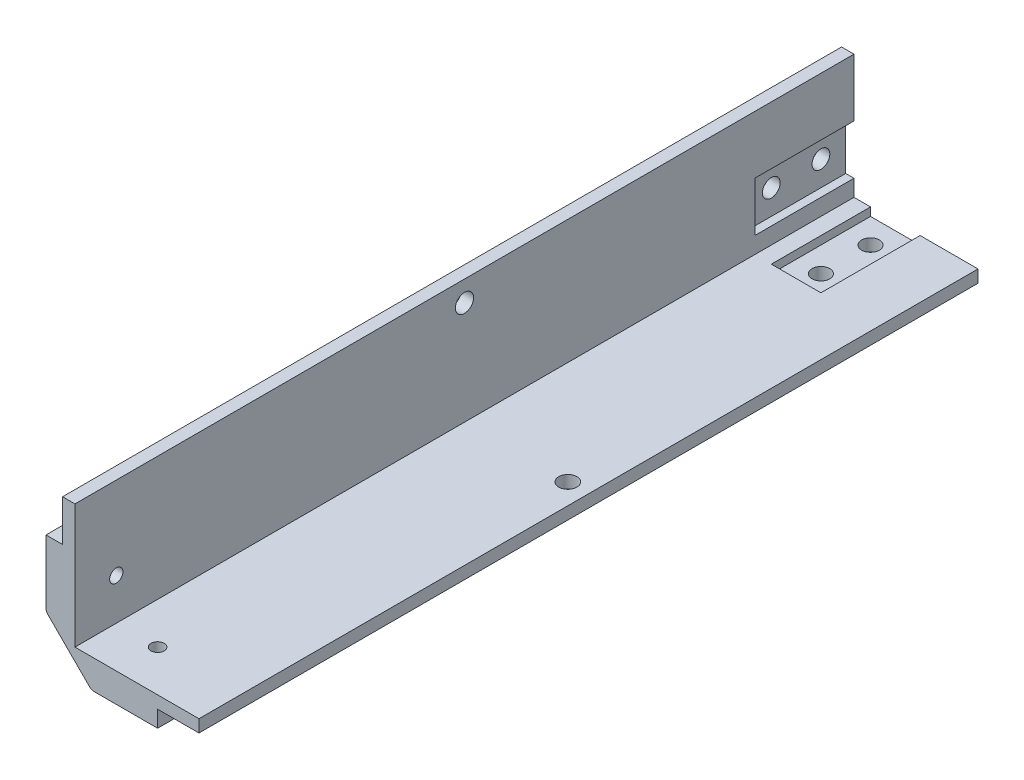
ISO-10303-21;
HEADER;
FILE_DESCRIPTION(('STEP AP214'),'2;1');
FILE_NAME('part.step','',(''),(''),'','','');
FILE_SCHEMA(('AUTOMOTIVE_DESIGN { 1 0 10303 214 1 1 1 1 }'));
ENDSEC;
DATA;
#1=APPLICATION_CONTEXT('core data for automotive mechanical design processes');
#2=APPLICATION_PROTOCOL_DEFINITION('international standard','automotive_design',2000,#1);
#3=PRODUCT_CONTEXT('',#1,'mechanical');
#4=PRODUCT('Part','Part','',(#3));
#5=PRODUCT_RELATED_PRODUCT_CATEGORY('part','',(#4));
#6=PRODUCT_DEFINITION_FORMATION('','',#4);
#7=PRODUCT_DEFINITION_CONTEXT('part definition',#1,'design');
#8=PRODUCT_DEFINITION('design','',#6,#7);
#9=PRODUCT_DEFINITION_SHAPE('','',#8);
#10=(LENGTH_UNIT() NAMED_UNIT(*) SI_UNIT(.MILLI.,.METRE.));
#11=(NAMED_UNIT(*) PLANE_ANGLE_UNIT() SI_UNIT($,.RADIAN.));
#12=(NAMED_UNIT(*) SI_UNIT($,.STERADIAN.) SOLID_ANGLE_UNIT());
#13=UNCERTAINTY_MEASURE_WITH_UNIT(LENGTH_MEASURE(1.E-05),#10,'distance_accuracy_value','');
#14=(GEOMETRIC_REPRESENTATION_CONTEXT(3) GLOBAL_UNCERTAINTY_ASSIGNED_CONTEXT((#13)) GLOBAL_UNIT_ASSIGNED_CONTEXT((#10,
#11,#12)) REPRESENTATION_CONTEXT('',''));
#15=CARTESIAN_POINT('',(0.,0.,0.));
#16=DIRECTION('',(0.,0.,1.));
#17=DIRECTION('',(1.,0.,0.));
#18=AXIS2_PLACEMENT_3D('',#15,#16,#17);
#19=CARTESIAN_POINT('',(-3.,20.,91.5500000000001));
#20=DIRECTION('',(-1.,0.,0.));
#21=DIRECTION('',(0.,0.,1.));
#22=AXIS2_PLACEMENT_3D('',#19,#20,#21);
#23=PLANE('',#22);
#24=CARTESIAN_POINT('',(-3.,25.,185.775));
#25=DIRECTION('',(-1.,0.,0.));
#26=DIRECTION('',(0.,0.,1.));
#27=AXIS2_PLACEMENT_3D('',#24,#25,#26);
#28=CIRCLE('',#27,2.2);
#29=CARTESIAN_POINT('',(-3.,25.,187.975));
#30=VERTEX_POINT('',#29);
#31=EDGE_CURVE('E261',#30,#30,#28,.T.);
#32=ORIENTED_EDGE('',*,*,#31,.F.);
#33=EDGE_LOOP('',(#32));
#34=FACE_BOUND('',#33,.T.);
#35=DIRECTION('',(0.,-1.,0.));
#36=VECTOR('',#35,1.);
#37=CARTESIAN_POINT('',(-3.,20.,91.5500000000001));
#38=LINE('',#37,#36);
#39=CARTESIAN_POINT('',(-3.,30.,91.5500000000001));
#40=VERTEX_POINT('',#39);
#41=CARTESIAN_POINT('',(-3.,20.,91.5500000000001));
#42=VERTEX_POINT('',#41);
#43=EDGE_CURVE('E341',#40,#42,#38,.T.);
#44=ORIENTED_EDGE('',*,*,#43,.T.);
#45=DIRECTION('',(0.,0.,-1.));
#46=VECTOR('',#45,1.);
#47=CARTESIAN_POINT('',(-3.,20.,280.));
#48=LINE('',#47,#46);
#49=CARTESIAN_POINT('',(-3.,20.,280.));
#50=VERTEX_POINT('',#49);
#51=EDGE_CURVE('E278',#50,#42,#48,.T.);
#52=ORIENTED_EDGE('',*,*,#51,.F.);
#53=DIRECTION('',(0.,-1.,0.));
#54=VECTOR('',#53,1.);
#55=CARTESIAN_POINT('',(-3.,20.,280.));
#56=LINE('',#55,#54);
#57=CARTESIAN_POINT('',(-3.,30.,280.));
#58=VERTEX_POINT('',#57);
#59=EDGE_CURVE('E327',#58,#50,#56,.T.);
#60=ORIENTED_EDGE('',*,*,#59,.F.);
#61=DIRECTION('',(0.,0.,1.));
#62=VECTOR('',#61,1.);
#63=CARTESIAN_POINT('',(-3.,30.,91.5500000000001));
#64=LINE('',#63,#62);
#65=EDGE_CURVE('E286',#40,#58,#64,.T.);
#66=ORIENTED_EDGE('',*,*,#65,.F.);
#67=EDGE_LOOP('',(#44,#52,#60,#66));
#68=FACE_BOUND('',#67,.T.);
#69=ADVANCED_FACE('F44',(#34,#68),#23,.T.);
#70=CARTESIAN_POINT('',(7.,-3.,91.5500000000001));
#71=DIRECTION('',(0.,-1.,0.));
#72=DIRECTION('',(0.,0.,-1.));
#73=AXIS2_PLACEMENT_3D('',#70,#71,#72);
#74=PLANE('',#73);
#75=CARTESIAN_POINT('',(25.,-3.,185.775));
#76=DIRECTION('',(0.,-1.,0.));
#77=DIRECTION('',(0.,0.,-1.));
#78=AXIS2_PLACEMENT_3D('',#75,#76,#77);
#79=CIRCLE('',#78,2.19999999999999);
#80=CARTESIAN_POINT('',(25.,-3.,183.575));
#81=VERTEX_POINT('',#80);
#82=EDGE_CURVE('E249',#81,#81,#79,.T.);
#83=ORIENTED_EDGE('',*,*,#82,.F.);
#84=EDGE_LOOP('',(#83));
#85=FACE_BOUND('',#84,.T.);
#86=DIRECTION('',(1.,0.,0.));
#87=VECTOR('',#86,1.);
#88=CARTESIAN_POINT('',(7.,-3.,280.));
#89=LINE('',#88,#87);
#90=CARTESIAN_POINT('',(20.,-3.,280.));
#91=VERTEX_POINT('',#90);
#92=CARTESIAN_POINT('',(30.,-3.,280.));
#93=VERTEX_POINT('',#92);
#94=EDGE_CURVE('E352',#91,#93,#89,.T.);
#95=ORIENTED_EDGE('',*,*,#94,.F.);
#96=DIRECTION('',(0.,0.,1.));
#97=VECTOR('',#96,1.);
#98=CARTESIAN_POINT('',(20.,-3.,91.5500000000001));
#99=LINE('',#98,#97);
#100=CARTESIAN_POINT('',(20.,-3.,91.5500000000001));
#101=VERTEX_POINT('',#100);
#102=EDGE_CURVE('E301',#101,#91,#99,.T.);
#103=ORIENTED_EDGE('',*,*,#102,.F.);
#104=DIRECTION('',(1.,0.,0.));
#105=VECTOR('',#104,1.);
#106=CARTESIAN_POINT('',(7.,-3.,91.5500000000001));
#107=LINE('',#106,#105);
#108=CARTESIAN_POINT('',(30.,-3.,91.5500000000001));
#109=VERTEX_POINT('',#108);
#110=EDGE_CURVE('E332',#101,#109,#107,.T.);
#111=ORIENTED_EDGE('',*,*,#110,.T.);
#112=DIRECTION('',(0.,0.,-1.));
#113=VECTOR('',#112,1.);
#114=CARTESIAN_POINT('',(30.,-3.,280.));
#115=LINE('',#114,#113);
#116=EDGE_CURVE('E316',#93,#109,#115,.T.);
#117=ORIENTED_EDGE('',*,*,#116,.F.);
#118=EDGE_LOOP('',(#95,#103,#111,#117));
#119=FACE_BOUND('',#118,.T.);
#120=ADVANCED_FACE('F414',(#85,#119),#74,.T.);
#121=CARTESIAN_POINT('',(-7.,7.,91.5500000000001));
#122=DIRECTION('',(-1.,0.,0.));
#123=DIRECTION('',(0.,0.,1.));
#124=AXIS2_PLACEMENT_3D('',#121,#122,#123);
#125=PLANE('',#124);
#126=CARTESIAN_POINT('',(-7.,10.,270.));
#127=DIRECTION('',(-1.,0.,0.));
#128=DIRECTION('',(0.,0.,1.));
#129=AXIS2_PLACEMENT_3D('',#126,#127,#128);
#130=CIRCLE('',#129,3.36);
#131=CARTESIAN_POINT('',(-7.,10.,273.36));
#132=VERTEX_POINT('',#131);
#133=EDGE_CURVE('E264',#132,#132,#130,.T.);
#134=ORIENTED_EDGE('',*,*,#133,.F.);
#135=EDGE_LOOP('',(#134));
#136=FACE_BOUND('',#135,.T.);
#137=DIRECTION('',(0.,-1.,0.));
#138=VECTOR('',#137,1.);
#139=CARTESIAN_POINT('',(-7.,7.,91.5500000000001));
#140=LINE('',#139,#138);
#141=CARTESIAN_POINT('',(-7.00000000000001,20.,91.5500000000001));
#142=VERTEX_POINT('',#141);
#143=CARTESIAN_POINT('',(-7.,4.62132034355964,91.5500000000001));
#144=VERTEX_POINT('',#143);
#145=EDGE_CURVE('E323',#142,#144,#140,.T.);
#146=ORIENTED_EDGE('',*,*,#145,.T.);
#147=DIRECTION('',(0.,0.,1.));
#148=VECTOR('',#147,1.);
#149=CARTESIAN_POINT('',(-7.,4.62132034355964,91.5500000000001));
#150=LINE('',#149,#148);
#151=CARTESIAN_POINT('',(-7.,4.62132034355964,280.));
#152=VERTEX_POINT('',#151);
#153=EDGE_CURVE('E362',#144,#152,#150,.T.);
#154=ORIENTED_EDGE('',*,*,#153,.T.);
#155=DIRECTION('',(0.,-1.,0.));
#156=VECTOR('',#155,1.);
#157=CARTESIAN_POINT('',(-7.,7.,280.));
#158=LINE('',#157,#156);
#159=CARTESIAN_POINT('',(-7.00000000000001,20.,280.));
#160=VERTEX_POINT('',#159);
#161=EDGE_CURVE('E322',#160,#152,#158,.T.);
#162=ORIENTED_EDGE('',*,*,#161,.F.);
#163=DIRECTION('',(0.,0.,-1.));
#164=VECTOR('',#163,1.);
#165=CARTESIAN_POINT('',(-7.00000000000001,20.,280.));
#166=LINE('',#165,#164);
#167=EDGE_CURVE('E283',#160,#142,#166,.T.);
#168=ORIENTED_EDGE('',*,*,#167,.T.);
#169=EDGE_LOOP('',(#146,#154,#162,#168));
#170=FACE_BOUND('',#169,.T.);
#171=ADVANCED_FACE('F387',(#136,#170),#125,.T.);
#172=CARTESIAN_POINT('',(0.,0.,91.5500000000001));
#173=DIRECTION('',(1.,0.,0.));
#174=DIRECTION('',(0.,1.,0.));
#175=AXIS2_PLACEMENT_3D('',#172,#173,#174);
#176=PLANE('',#175);
#177=DIRECTION('',(0.,0.,-1.));
#178=VECTOR('',#177,1.);
#179=CARTESIAN_POINT('',(0.,3.99999999999999,91.5500000000001));
#180=LINE('',#179,#178);
#181=CARTESIAN_POINT('',(0.,3.99999999999999,115.55));
#182=VERTEX_POINT('',#181);
#183=CARTESIAN_POINT('',(0.,3.99999999999999,91.5500000000001));
#184=VERTEX_POINT('',#183);
#185=EDGE_CURVE('E205',#182,#184,#180,.T.);
#186=ORIENTED_EDGE('',*,*,#185,.F.);
#187=DIRECTION('',(0.,-1.,0.));
#188=VECTOR('',#187,1.);
#189=CARTESIAN_POINT('',(0.,3.99999999999999,115.55));
#190=LINE('',#189,#188);
#191=CARTESIAN_POINT('',(0.,16.,115.55));
#192=VERTEX_POINT('',#191);
#193=EDGE_CURVE('E441',#192,#182,#190,.T.);
#194=ORIENTED_EDGE('',*,*,#193,.F.);
#195=DIRECTION('',(0.,0.,1.));
#196=VECTOR('',#195,1.);
#197=CARTESIAN_POINT('',(0.,16.,91.5500000000001));
#198=LINE('',#197,#196);
#199=CARTESIAN_POINT('',(0.,16.,91.5500000000001));
#200=VERTEX_POINT('',#199);
#201=EDGE_CURVE('E439',#200,#192,#198,.T.);
#202=ORIENTED_EDGE('',*,*,#201,.F.);
#203=DIRECTION('',(0.,1.,0.));
#204=VECTOR('',#203,1.);
#205=CARTESIAN_POINT('',(0.,0.,91.5500000000001));
#206=LINE('',#205,#204);
#207=CARTESIAN_POINT('',(0.,30.,91.5500000000001));
#208=VERTEX_POINT('',#207);
#209=EDGE_CURVE('E210',#200,#208,#206,.T.);
#210=ORIENTED_EDGE('',*,*,#209,.T.);
#211=DIRECTION('',(0.,0.,-1.));
#212=VECTOR('',#211,1.);
#213=CARTESIAN_POINT('',(0.,30.,280.));
#214=LINE('',#213,#212);
#215=CARTESIAN_POINT('',(0.,30.,280.));
#216=VERTEX_POINT('',#215);
#217=EDGE_CURVE('E294',#216,#208,#214,.T.);
#218=ORIENTED_EDGE('',*,*,#217,.F.);
#219=DIRECTION('',(0.,1.,0.));
#220=VECTOR('',#219,1.);
#221=CARTESIAN_POINT('',(0.,0.,280.));
#222=LINE('',#221,#220);
#223=CARTESIAN_POINT('',(0.,0.,280.));
#224=VERTEX_POINT('',#223);
#225=EDGE_CURVE('E357',#224,#216,#222,.T.);
#226=ORIENTED_EDGE('',*,*,#225,.F.);
#227=DIRECTION('',(0.,0.,1.));
#228=VECTOR('',#227,1.);
#229=CARTESIAN_POINT('',(0.,0.,91.5500000000001));
#230=LINE('',#229,#228);
#231=CARTESIAN_POINT('',(0.,0.,91.5500000000001));
#232=VERTEX_POINT('',#231);
#233=EDGE_CURVE('E344',#232,#224,#230,.T.);
#234=ORIENTED_EDGE('',*,*,#233,.F.);
#235=EDGE_CURVE('E338',#232,#184,#206,.T.);
#236=ORIENTED_EDGE('',*,*,#235,.T.);
#237=EDGE_LOOP('',(#186,#194,#202,#210,#218,#226,#234,#236));
#238=FACE_BOUND('',#237,.T.);
#239=CARTESIAN_POINT('',(0.,25.,185.775));
#240=DIRECTION('',(1.,0.,0.));
#241=DIRECTION('',(0.,1.,0.));
#242=AXIS2_PLACEMENT_3D('',#239,#240,#241);
#243=CIRCLE('',#242,2.2);
#244=CARTESIAN_POINT('',(0.,27.2,185.775));
#245=VERTEX_POINT('',#244);
#246=EDGE_CURVE('E48',#245,#245,#243,.T.);
#247=ORIENTED_EDGE('',*,*,#246,.F.);
#248=EDGE_LOOP('',(#247));
#249=FACE_BOUND('',#248,.T.);
#250=CARTESIAN_POINT('',(0.,10.,270.));
#251=DIRECTION('',(1.,0.,0.));
#252=DIRECTION('',(0.,1.,0.));
#253=AXIS2_PLACEMENT_3D('',#250,#251,#252);
#254=CIRCLE('',#253,1.59999999999998);
#255=CARTESIAN_POINT('',(0.,11.6,270.));
#256=VERTEX_POINT('',#255);
#257=EDGE_CURVE('E270',#256,#256,#254,.T.);
#258=ORIENTED_EDGE('',*,*,#257,.F.);
#259=EDGE_LOOP('',(#258));
#260=FACE_BOUND('',#259,.T.);
#261=ADVANCED_FACE('F436',(#238,#249,#260),#176,.T.);
#262=CARTESIAN_POINT('',(20.,0.,91.5500000000001));
#263=DIRECTION('',(0.,1.,0.));
#264=DIRECTION('',(0.,0.,1.));
#265=AXIS2_PLACEMENT_3D('',#262,#263,#264);
#266=PLANE('',#265);
#267=DIRECTION('',(0.,0.,1.));
#268=VECTOR('',#267,1.);
#269=CARTESIAN_POINT('',(4.,0.,91.5500000000001));
#270=LINE('',#269,#268);
#271=CARTESIAN_POINT('',(4.,0.,91.5500000000001));
#272=VERTEX_POINT('',#271);
#273=CARTESIAN_POINT('',(4.,0.,115.55));
#274=VERTEX_POINT('',#273);
#275=EDGE_CURVE('E230',#272,#274,#270,.T.);
#276=ORIENTED_EDGE('',*,*,#275,.F.);
#277=DIRECTION('',(-1.,0.,0.));
#278=VECTOR('',#277,1.);
#279=CARTESIAN_POINT('',(20.,0.,91.5500000000001));
#280=LINE('',#279,#278);
#281=EDGE_CURVE('E334',#272,#232,#280,.T.);
#282=ORIENTED_EDGE('',*,*,#281,.T.);
#283=ORIENTED_EDGE('',*,*,#233,.T.);
#284=DIRECTION('',(-1.,0.,0.));
#285=VECTOR('',#284,1.);
#286=CARTESIAN_POINT('',(20.,0.,280.));
#287=LINE('',#286,#285);
#288=CARTESIAN_POINT('',(30.,0.,280.));
#289=VERTEX_POINT('',#288);
#290=EDGE_CURVE('E354',#289,#224,#287,.T.);
#291=ORIENTED_EDGE('',*,*,#290,.F.);
#292=DIRECTION('',(0.,0.,1.));
#293=VECTOR('',#292,1.);
#294=CARTESIAN_POINT('',(30.,0.,91.5500000000001));
#295=LINE('',#294,#293);
#296=CARTESIAN_POINT('',(30.,0.,91.5500000000001));
#297=VERTEX_POINT('',#296);
#298=EDGE_CURVE('E307',#297,#289,#295,.T.);
#299=ORIENTED_EDGE('',*,*,#298,.F.);
#300=CARTESIAN_POINT('',(16.,0.,91.5500000000001));
#301=VERTEX_POINT('',#300);
#302=EDGE_CURVE('E335',#297,#301,#280,.T.);
#303=ORIENTED_EDGE('',*,*,#302,.T.);
#304=DIRECTION('',(0.,0.,-1.));
#305=VECTOR('',#304,1.);
#306=CARTESIAN_POINT('',(16.,0.,91.5500000000001));
#307=LINE('',#306,#305);
#308=CARTESIAN_POINT('',(16.,0.,115.55));
#309=VERTEX_POINT('',#308);
#310=EDGE_CURVE('E235',#309,#301,#307,.T.);
#311=ORIENTED_EDGE('',*,*,#310,.F.);
#312=DIRECTION('',(1.,0.,0.));
#313=VECTOR('',#312,1.);
#314=CARTESIAN_POINT('',(4.,0.,115.55));
#315=LINE('',#314,#313);
#316=EDGE_CURVE('E243',#274,#309,#315,.T.);
#317=ORIENTED_EDGE('',*,*,#316,.F.);
#318=EDGE_LOOP('',(#276,#282,#283,#291,#299,#303,#311,#317));
#319=FACE_BOUND('',#318,.T.);
#320=CARTESIAN_POINT('',(25.,0.,185.775));
#321=DIRECTION('',(0.,1.,0.));
#322=DIRECTION('',(0.,0.,1.));
#323=AXIS2_PLACEMENT_3D('',#320,#321,#322);
#324=CIRCLE('',#323,2.19999999999999);
#325=CARTESIAN_POINT('',(25.,0.,187.975));
#326=VERTEX_POINT('',#325);
#327=EDGE_CURVE('E258',#326,#326,#324,.T.);
#328=ORIENTED_EDGE('',*,*,#327,.F.);
#329=EDGE_LOOP('',(#328));
#330=FACE_BOUND('',#329,.T.);
#331=CARTESIAN_POINT('',(10.,0.,270.));
#332=DIRECTION('',(0.,1.,0.));
#333=DIRECTION('',(0.,0.,1.));
#334=AXIS2_PLACEMENT_3D('',#331,#332,#333);
#335=CIRCLE('',#334,1.59999999999999);
#336=CARTESIAN_POINT('',(10.,0.,271.6));
#337=VERTEX_POINT('',#336);
#338=EDGE_CURVE('E277',#337,#337,#335,.T.);
#339=ORIENTED_EDGE('',*,*,#338,.F.);
#340=EDGE_LOOP('',(#339));
#341=FACE_BOUND('',#340,.T.);
#342=ADVANCED_FACE('F424',(#319,#330,#341),#266,.T.);
#343=CARTESIAN_POINT('',(4.,-7.,91.5500000000001));
#344=DIRECTION('',(0.,-1.,0.));
#345=DIRECTION('',(0.,0.,-1.));
#346=AXIS2_PLACEMENT_3D('',#343,#344,#345);
#347=PLANE('',#346);
#348=CARTESIAN_POINT('',(10.,-7.,270.));
#349=DIRECTION('',(0.,-1.,0.));
#350=DIRECTION('',(0.,0.,-1.));
#351=AXIS2_PLACEMENT_3D('',#348,#349,#350);
#352=CIRCLE('',#351,3.36);
#353=CARTESIAN_POINT('',(10.,-7.,266.64));
#354=VERTEX_POINT('',#353);
#355=EDGE_CURVE('E271',#354,#354,#352,.T.);
#356=ORIENTED_EDGE('',*,*,#355,.F.);
#357=EDGE_LOOP('',(#356));
#358=FACE_BOUND('',#357,.T.);
#359=DIRECTION('',(1.,0.,0.));
#360=VECTOR('',#359,1.);
#361=CARTESIAN_POINT('',(4.,-7.,280.));
#362=LINE('',#361,#360);
#363=CARTESIAN_POINT('',(4.62132034355964,-7.,280.));
#364=VERTEX_POINT('',#363);
#365=CARTESIAN_POINT('',(20.,-7.00000000000001,280.));
#366=VERTEX_POINT('',#365);
#367=EDGE_CURVE('E350',#364,#366,#362,.T.);
#368=ORIENTED_EDGE('',*,*,#367,.F.);
#369=DIRECTION('',(0.,0.,1.));
#370=VECTOR('',#369,1.);
#371=CARTESIAN_POINT('',(4.62132034355964,-7.,91.5500000000001));
#372=LINE('',#371,#370);
#373=CARTESIAN_POINT('',(4.62132034355964,-7.,91.5500000000001));
#374=VERTEX_POINT('',#373);
#375=EDGE_CURVE('E11',#364,#374,#372,.F.);
#376=ORIENTED_EDGE('',*,*,#375,.T.);
#377=DIRECTION('',(1.,0.,0.));
#378=VECTOR('',#377,1.);
#379=CARTESIAN_POINT('',(4.,-7.,91.5500000000001));
#380=LINE('',#379,#378);
#381=CARTESIAN_POINT('',(20.,-7.00000000000001,91.5500000000001));
#382=VERTEX_POINT('',#381);
#383=EDGE_CURVE('E330',#374,#382,#380,.T.);
#384=ORIENTED_EDGE('',*,*,#383,.T.);
#385=DIRECTION('',(0.,0.,1.));
#386=VECTOR('',#385,1.);
#387=CARTESIAN_POINT('',(20.,-7.00000000000001,91.5500000000001));
#388=LINE('',#387,#386);
#389=EDGE_CURVE('E303',#382,#366,#388,.T.);
#390=ORIENTED_EDGE('',*,*,#389,.T.);
#391=EDGE_LOOP('',(#368,#376,#384,#390));
#392=FACE_BOUND('',#391,.T.);
#393=ADVANCED_FACE('F403',(#358,#392),#347,.T.);
#394=CARTESIAN_POINT('',(-7.,4.,91.5500000000001));
#395=DIRECTION('',(-0.707106781186548,-0.707106781186548,0.));
#396=DIRECTION('',(0.707106781186548,-0.707106781186548,0.));
#397=AXIS2_PLACEMENT_3D('',#394,#395,#396);
#398=PLANE('',#397);
#399=DIRECTION('',(0.707106781186548,-0.707106781186548,0.));
#400=VECTOR('',#399,1.);
#401=CARTESIAN_POINT('',(-7.,4.,280.));
#402=LINE('',#401,#400);
#403=CARTESIAN_POINT('',(-6.56066017177982,3.56066017177982,280.));
#404=VERTEX_POINT('',#403);
#405=CARTESIAN_POINT('',(3.56066017177982,-6.56066017177982,280.));
#406=VERTEX_POINT('',#405);
#407=EDGE_CURVE('E347',#404,#406,#402,.T.);
#408=ORIENTED_EDGE('',*,*,#407,.F.);
#409=DIRECTION('',(0.,0.,1.));
#410=VECTOR('',#409,1.);
#411=CARTESIAN_POINT('',(-6.56066017177982,3.56066017177982,91.5500000000001));
#412=LINE('',#411,#410);
#413=CARTESIAN_POINT('',(-6.56066017177982,3.56066017177982,91.5500000000001));
#414=VERTEX_POINT('',#413);
#415=EDGE_CURVE('E376',#404,#414,#412,.F.);
#416=ORIENTED_EDGE('',*,*,#415,.T.);
#417=DIRECTION('',(0.707106781186548,-0.707106781186548,0.));
#418=VECTOR('',#417,1.);
#419=CARTESIAN_POINT('',(-7.,4.,91.5500000000001));
#420=LINE('',#419,#418);
#421=CARTESIAN_POINT('',(3.56066017177982,-6.56066017177982,91.5500000000001));
#422=VERTEX_POINT('',#421);
#423=EDGE_CURVE('E326',#414,#422,#420,.T.);
#424=ORIENTED_EDGE('',*,*,#423,.T.);
#425=DIRECTION('',(0.,0.,1.));
#426=VECTOR('',#425,1.);
#427=CARTESIAN_POINT('',(3.56066017177982,-6.56066017177982,91.5500000000001));
#428=LINE('',#427,#426);
#429=EDGE_CURVE('E373',#422,#406,#428,.T.);
#430=ORIENTED_EDGE('',*,*,#429,.T.);
#431=EDGE_LOOP('',(#408,#416,#424,#430));
#432=FACE_BOUND('',#431,.T.);
#433=ADVANCED_FACE('F395',(#432),#398,.T.);
#434=CARTESIAN_POINT('',(0.,0.,91.5500000000001));
#435=DIRECTION('',(0.,0.,1.));
#436=DIRECTION('',(1.,0.,0.));
#437=AXIS2_PLACEMENT_3D('',#434,#435,#436);
#438=PLANE('',#437);
#439=DIRECTION('',(0.,1.,0.));
#440=VECTOR('',#439,1.);
#441=CARTESIAN_POINT('',(-2.,3.99999999999999,91.5500000000001));
#442=LINE('',#441,#440);
#443=CARTESIAN_POINT('',(-2.,3.99999999999999,91.5500000000001));
#444=VERTEX_POINT('',#443);
#445=CARTESIAN_POINT('',(-2.,16.,91.5500000000001));
#446=VERTEX_POINT('',#445);
#447=EDGE_CURVE('E199',#444,#446,#442,.T.);
#448=ORIENTED_EDGE('',*,*,#447,.F.);
#449=DIRECTION('',(1.,0.,0.));
#450=VECTOR('',#449,1.);
#451=CARTESIAN_POINT('',(-2.,3.99999999999999,91.5500000000001));
#452=LINE('',#451,#450);
#453=EDGE_CURVE('E221',#444,#184,#452,.T.);
#454=ORIENTED_EDGE('',*,*,#453,.T.);
#455=ORIENTED_EDGE('',*,*,#235,.F.);
#456=ORIENTED_EDGE('',*,*,#281,.F.);
#457=DIRECTION('',(0.,1.,0.));
#458=VECTOR('',#457,1.);
#459=CARTESIAN_POINT('',(4.,-2.,91.5500000000001));
#460=LINE('',#459,#458);
#461=CARTESIAN_POINT('',(4.,-2.,91.5500000000001));
#462=VERTEX_POINT('',#461);
#463=EDGE_CURVE('E247',#462,#272,#460,.T.);
#464=ORIENTED_EDGE('',*,*,#463,.F.);
#465=DIRECTION('',(-1.,0.,0.));
#466=VECTOR('',#465,1.);
#467=CARTESIAN_POINT('',(4.,-2.,91.5500000000001));
#468=LINE('',#467,#466);
#469=CARTESIAN_POINT('',(16.,-2.,91.5500000000001));
#470=VERTEX_POINT('',#469);
#471=EDGE_CURVE('E238',#470,#462,#468,.T.);
#472=ORIENTED_EDGE('',*,*,#471,.F.);
#473=DIRECTION('',(0.,1.,0.));
#474=VECTOR('',#473,1.);
#475=CARTESIAN_POINT('',(16.,-2.,91.5500000000001));
#476=LINE('',#475,#474);
#477=EDGE_CURVE('E250',#470,#301,#476,.T.);
#478=ORIENTED_EDGE('',*,*,#477,.T.);
#479=ORIENTED_EDGE('',*,*,#302,.F.);
#480=DIRECTION('',(0.,1.,0.));
#481=VECTOR('',#480,1.);
#482=CARTESIAN_POINT('',(30.,-3.,91.5500000000001));
#483=LINE('',#482,#481);
#484=EDGE_CURVE('E319',#109,#297,#483,.T.);
#485=ORIENTED_EDGE('',*,*,#484,.F.);
#486=ORIENTED_EDGE('',*,*,#110,.F.);
#487=DIRECTION('',(0.,1.,0.));
#488=VECTOR('',#487,1.);
#489=CARTESIAN_POINT('',(20.,-195.897862613636,91.5500000000001));
#490=LINE('',#489,#488);
#491=EDGE_CURVE('E304',#382,#101,#490,.T.);
#492=ORIENTED_EDGE('',*,*,#491,.F.);
#493=ORIENTED_EDGE('',*,*,#383,.F.);
#494=CARTESIAN_POINT('',(4.62132034355964,-5.5,91.5500000000001));
#495=DIRECTION('',(0.,0.,1.));
#496=DIRECTION('',(1.,0.,0.));
#497=AXIS2_PLACEMENT_3D('',#494,#495,#496);
#498=CIRCLE('',#497,1.5);
#499=EDGE_CURVE('E378',#374,#422,#498,.F.);
#500=ORIENTED_EDGE('',*,*,#499,.T.);
#501=ORIENTED_EDGE('',*,*,#423,.F.);
#502=CARTESIAN_POINT('',(-5.5,4.62132034355964,91.5500000000001));
#503=DIRECTION('',(0.,0.,1.));
#504=DIRECTION('',(1.,0.,0.));
#505=AXIS2_PLACEMENT_3D('',#502,#503,#504);
#506=CIRCLE('',#505,1.5);
#507=EDGE_CURVE('E53',#414,#144,#506,.F.);
#508=ORIENTED_EDGE('',*,*,#507,.T.);
#509=ORIENTED_EDGE('',*,*,#145,.F.);
#510=DIRECTION('',(1.,0.,0.));
#511=VECTOR('',#510,1.);
#512=CARTESIAN_POINT('',(-195.897862613636,20.,91.5500000000001));
#513=LINE('',#512,#511);
#514=EDGE_CURVE('E281',#142,#42,#513,.T.);
#515=ORIENTED_EDGE('',*,*,#514,.T.);
#516=ORIENTED_EDGE('',*,*,#43,.F.);
#517=DIRECTION('',(-1.,0.,0.));
#518=VECTOR('',#517,1.);
#519=CARTESIAN_POINT('',(0.,30.,91.5500000000001));
#520=LINE('',#519,#518);
#521=EDGE_CURVE('E297',#208,#40,#520,.T.);
#522=ORIENTED_EDGE('',*,*,#521,.F.);
#523=ORIENTED_EDGE('',*,*,#209,.F.);
#524=DIRECTION('',(1.,0.,0.));
#525=VECTOR('',#524,1.);
#526=CARTESIAN_POINT('',(-2.,16.,91.5500000000001));
#527=LINE('',#526,#525);
#528=EDGE_CURVE('E194',#446,#200,#527,.T.);
#529=ORIENTED_EDGE('',*,*,#528,.F.);
#530=EDGE_LOOP('',(#448,#454,#455,#456,#464,#472,#478,#479,#485,#486,#492,#493,#500,#501,#508,
#509,#515,#516,#522,#523,#529));
#531=FACE_BOUND('',#530,.T.);
#532=ADVANCED_FACE('F208',(#531),#438,.F.);
#533=CARTESIAN_POINT('',(0.,0.,280.));
#534=DIRECTION('',(0.,0.,1.));
#535=DIRECTION('',(1.,0.,0.));
#536=AXIS2_PLACEMENT_3D('',#533,#534,#535);
#537=PLANE('',#536);
#538=ORIENTED_EDGE('',*,*,#161,.T.);
#539=CARTESIAN_POINT('',(-5.5,4.62132034355964,280.));
#540=DIRECTION('',(0.,0.,1.));
#541=DIRECTION('',(1.,0.,0.));
#542=AXIS2_PLACEMENT_3D('',#539,#540,#541);
#543=CIRCLE('',#542,1.5);
#544=EDGE_CURVE('E371',#152,#404,#543,.T.);
#545=ORIENTED_EDGE('',*,*,#544,.T.);
#546=ORIENTED_EDGE('',*,*,#407,.T.);
#547=CARTESIAN_POINT('',(4.62132034355964,-5.5,280.));
#548=DIRECTION('',(0.,0.,1.));
#549=DIRECTION('',(1.,0.,0.));
#550=AXIS2_PLACEMENT_3D('',#547,#548,#549);
#551=CIRCLE('',#550,1.5);
#552=EDGE_CURVE('E369',#406,#364,#551,.T.);
#553=ORIENTED_EDGE('',*,*,#552,.T.);
#554=ORIENTED_EDGE('',*,*,#367,.T.);
#555=DIRECTION('',(0.,1.,0.));
#556=VECTOR('',#555,1.);
#557=CARTESIAN_POINT('',(20.,-195.897862613636,280.));
#558=LINE('',#557,#556);
#559=EDGE_CURVE('E300',#366,#91,#558,.T.);
#560=ORIENTED_EDGE('',*,*,#559,.T.);
#561=ORIENTED_EDGE('',*,*,#94,.T.);
#562=DIRECTION('',(0.,-1.,0.));
#563=VECTOR('',#562,1.);
#564=CARTESIAN_POINT('',(30.,0.,280.));
#565=LINE('',#564,#563);
#566=EDGE_CURVE('E313',#289,#93,#565,.T.);
#567=ORIENTED_EDGE('',*,*,#566,.F.);
#568=ORIENTED_EDGE('',*,*,#290,.T.);
#569=ORIENTED_EDGE('',*,*,#225,.T.);
#570=DIRECTION('',(1.,0.,0.));
#571=VECTOR('',#570,1.);
#572=CARTESIAN_POINT('',(-3.,30.,280.));
#573=LINE('',#572,#571);
#574=EDGE_CURVE('E291',#58,#216,#573,.T.);
#575=ORIENTED_EDGE('',*,*,#574,.F.);
#576=ORIENTED_EDGE('',*,*,#59,.T.);
#577=DIRECTION('',(1.,0.,0.));
#578=VECTOR('',#577,1.);
#579=CARTESIAN_POINT('',(-195.897862613636,20.,280.));
#580=LINE('',#579,#578);
#581=EDGE_CURVE('E282',#160,#50,#580,.T.);
#582=ORIENTED_EDGE('',*,*,#581,.F.);
#583=EDGE_LOOP('',(#538,#545,#546,#553,#554,#560,#561,#567,#568,#569,#575,#576,#582));
#584=FACE_BOUND('',#583,.T.);
#585=ADVANCED_FACE('F392',(#584),#537,.T.);
#586=CARTESIAN_POINT('',(30.,0.,0.));
#587=DIRECTION('',(1.,0.,0.));
#588=DIRECTION('',(0.,0.,-1.));
#589=AXIS2_PLACEMENT_3D('',#586,#587,#588);
#590=PLANE('',#589);
#591=ORIENTED_EDGE('',*,*,#298,.T.);
#592=ORIENTED_EDGE('',*,*,#566,.T.);
#593=ORIENTED_EDGE('',*,*,#116,.T.);
#594=ORIENTED_EDGE('',*,*,#484,.T.);
#595=EDGE_LOOP('',(#591,#592,#593,#594));
#596=FACE_BOUND('',#595,.T.);
#597=ADVANCED_FACE('F418',(#596),#590,.T.);
#598=CARTESIAN_POINT('',(20.,-195.897862613636,91.5500000000001));
#599=DIRECTION('',(-1.,0.,0.));
#600=DIRECTION('',(0.,0.,1.));
#601=AXIS2_PLACEMENT_3D('',#598,#599,#600);
#602=PLANE('',#601);
#603=ORIENTED_EDGE('',*,*,#389,.F.);
#604=ORIENTED_EDGE('',*,*,#491,.T.);
#605=ORIENTED_EDGE('',*,*,#102,.T.);
#606=ORIENTED_EDGE('',*,*,#559,.F.);
#607=EDGE_LOOP('',(#603,#604,#605,#606));
#608=FACE_BOUND('',#607,.T.);
#609=ADVANCED_FACE('F408',(#608),#602,.F.);
#610=CARTESIAN_POINT('',(0.,30.,0.));
#611=DIRECTION('',(0.,1.,0.));
#612=DIRECTION('',(0.,0.,1.));
#613=AXIS2_PLACEMENT_3D('',#610,#611,#612);
#614=PLANE('',#613);
#615=ORIENTED_EDGE('',*,*,#65,.T.);
#616=ORIENTED_EDGE('',*,*,#574,.T.);
#617=ORIENTED_EDGE('',*,*,#217,.T.);
#618=ORIENTED_EDGE('',*,*,#521,.T.);
#619=EDGE_LOOP('',(#615,#616,#617,#618));
#620=FACE_BOUND('',#619,.T.);
#621=ADVANCED_FACE('F433',(#620),#614,.T.);
#622=CARTESIAN_POINT('',(-195.897862613636,20.,280.));
#623=DIRECTION('',(0.,-1.,0.));
#624=DIRECTION('',(0.,0.,-1.));
#625=AXIS2_PLACEMENT_3D('',#622,#623,#624);
#626=PLANE('',#625);
#627=ORIENTED_EDGE('',*,*,#167,.F.);
#628=ORIENTED_EDGE('',*,*,#581,.T.);
#629=ORIENTED_EDGE('',*,*,#51,.T.);
#630=ORIENTED_EDGE('',*,*,#514,.F.);
#631=EDGE_LOOP('',(#627,#628,#629,#630));
#632=FACE_BOUND('',#631,.T.);
#633=ADVANCED_FACE('F533',(#632),#626,.F.);
#634=CARTESIAN_POINT('',(10.,-7.,270.));
#635=DIRECTION('',(0.,-1.,0.));
#636=DIRECTION('',(0.,0.,-1.));
#637=AXIS2_PLACEMENT_3D('',#634,#635,#636);
#638=CYLINDRICAL_SURFACE('',#637,1.59999999999999);
#639=ORIENTED_EDGE('',*,*,#338,.T.);
#640=EDGE_LOOP('',(#639));
#641=FACE_BOUND('',#640,.T.);
#642=CARTESIAN_POINT('',(10.,-5.23999999999999,270.));
#643=DIRECTION('',(0.,-1.,0.));
#644=DIRECTION('',(0.,0.,-1.));
#645=AXIS2_PLACEMENT_3D('',#642,#643,#644);
#646=CIRCLE('',#645,1.59999999999999);
#647=CARTESIAN_POINT('',(10.,-5.23999999999999,268.4));
#648=VERTEX_POINT('',#647);
#649=EDGE_CURVE('E274',#648,#648,#646,.T.);
#650=ORIENTED_EDGE('',*,*,#649,.T.);
#651=EDGE_LOOP('',(#650));
#652=FACE_BOUND('',#651,.T.);
#653=ADVANCED_FACE('F529',(#641,#652),#638,.F.);
#654=CARTESIAN_POINT('',(10.,-7.,270.));
#655=DIRECTION('',(0.,-1.,0.));
#656=DIRECTION('',(0.,0.,-1.));
#657=AXIS2_PLACEMENT_3D('',#654,#655,#656);
#658=CONICAL_SURFACE('',#657,3.36,0.785398163397448);
#659=ORIENTED_EDGE('',*,*,#649,.F.);
#660=EDGE_LOOP('',(#659));
#661=FACE_BOUND('',#660,.T.);
#662=ORIENTED_EDGE('',*,*,#355,.T.);
#663=EDGE_LOOP('',(#662));
#664=FACE_BOUND('',#663,.T.);
#665=ADVANCED_FACE('F519',(#661,#664),#658,.F.);
#666=CARTESIAN_POINT('',(-7.,10.,270.));
#667=DIRECTION('',(-1.,0.,0.));
#668=DIRECTION('',(0.,0.,1.));
#669=AXIS2_PLACEMENT_3D('',#666,#667,#668);
#670=CYLINDRICAL_SURFACE('',#669,1.59999999999998);
#671=ORIENTED_EDGE('',*,*,#257,.T.);
#672=EDGE_LOOP('',(#671));
#673=FACE_BOUND('',#672,.T.);
#674=CARTESIAN_POINT('',(-5.23999999999999,10.,270.));
#675=DIRECTION('',(-1.,0.,0.));
#676=DIRECTION('',(0.,0.,1.));
#677=AXIS2_PLACEMENT_3D('',#674,#675,#676);
#678=CIRCLE('',#677,1.59999999999999);
#679=CARTESIAN_POINT('',(-5.23999999999999,10.,271.6));
#680=VERTEX_POINT('',#679);
#681=EDGE_CURVE('E267',#680,#680,#678,.T.);
#682=ORIENTED_EDGE('',*,*,#681,.T.);
#683=EDGE_LOOP('',(#682));
#684=FACE_BOUND('',#683,.T.);
#685=ADVANCED_FACE('F513',(#673,#684),#670,.F.);
#686=CARTESIAN_POINT('',(-7.,10.,270.));
#687=DIRECTION('',(-1.,0.,0.));
#688=DIRECTION('',(0.,0.,1.));
#689=AXIS2_PLACEMENT_3D('',#686,#687,#688);
#690=CONICAL_SURFACE('',#689,3.36,0.785398163397448);
#691=ORIENTED_EDGE('',*,*,#681,.F.);
#692=EDGE_LOOP('',(#691));
#693=FACE_BOUND('',#692,.T.);
#694=ORIENTED_EDGE('',*,*,#133,.T.);
#695=EDGE_LOOP('',(#694));
#696=FACE_BOUND('',#695,.T.);
#697=ADVANCED_FACE('F507',(#693,#696),#690,.F.);
#698=CARTESIAN_POINT('',(-5.5,4.62132034355964,91.5500000000001));
#699=DIRECTION('',(0.,0.,1.));
#700=DIRECTION('',(1.,0.,0.));
#701=AXIS2_PLACEMENT_3D('',#698,#699,#700);
#702=CYLINDRICAL_SURFACE('',#701,1.5);
#703=ORIENTED_EDGE('',*,*,#507,.F.);
#704=ORIENTED_EDGE('',*,*,#415,.F.);
#705=ORIENTED_EDGE('',*,*,#544,.F.);
#706=ORIENTED_EDGE('',*,*,#153,.F.);
#707=EDGE_LOOP('',(#703,#704,#705,#706));
#708=FACE_BOUND('',#707,.T.);
#709=ADVANCED_FACE('F389',(#708),#702,.T.);
#710=CARTESIAN_POINT('',(4.62132034355964,-5.5,91.5500000000001));
#711=DIRECTION('',(0.,0.,1.));
#712=DIRECTION('',(1.,0.,0.));
#713=AXIS2_PLACEMENT_3D('',#710,#711,#712);
#714=CYLINDRICAL_SURFACE('',#713,1.5);
#715=ORIENTED_EDGE('',*,*,#499,.F.);
#716=ORIENTED_EDGE('',*,*,#375,.F.);
#717=ORIENTED_EDGE('',*,*,#552,.F.);
#718=ORIENTED_EDGE('',*,*,#429,.F.);
#719=EDGE_LOOP('',(#715,#716,#717,#718));
#720=FACE_BOUND('',#719,.T.);
#721=ADVANCED_FACE('F46',(#720),#714,.T.);
#722=CARTESIAN_POINT('',(-3.,25.,185.775));
#723=DIRECTION('',(-1.,0.,0.));
#724=DIRECTION('',(0.,0.,1.));
#725=AXIS2_PLACEMENT_3D('',#722,#723,#724);
#726=CYLINDRICAL_SURFACE('',#725,2.2);
#727=ORIENTED_EDGE('',*,*,#246,.T.);
#728=EDGE_LOOP('',(#727));
#729=FACE_BOUND('',#728,.T.);
#730=ORIENTED_EDGE('',*,*,#31,.T.);
#731=EDGE_LOOP('',(#730));
#732=FACE_BOUND('',#731,.T.);
#733=ADVANCED_FACE('F511',(#729,#732),#726,.F.);
#734=CARTESIAN_POINT('',(25.,-3.,185.775));
#735=DIRECTION('',(0.,-1.,0.));
#736=DIRECTION('',(0.,0.,-1.));
#737=AXIS2_PLACEMENT_3D('',#734,#735,#736);
#738=CYLINDRICAL_SURFACE('',#737,2.19999999999999);
#739=ORIENTED_EDGE('',*,*,#327,.T.);
#740=EDGE_LOOP('',(#739));
#741=FACE_BOUND('',#740,.T.);
#742=ORIENTED_EDGE('',*,*,#82,.T.);
#743=EDGE_LOOP('',(#742));
#744=FACE_BOUND('',#743,.T.);
#745=ADVANCED_FACE('F647',(#741,#744),#738,.F.);
#746=CARTESIAN_POINT('',(4.,-2.,91.5500000000001));
#747=DIRECTION('',(-1.,0.,0.));
#748=DIRECTION('',(0.,0.,1.));
#749=AXIS2_PLACEMENT_3D('',#746,#747,#748);
#750=PLANE('',#749);
#751=ORIENTED_EDGE('',*,*,#275,.T.);
#752=DIRECTION('',(0.,1.,0.));
#753=VECTOR('',#752,1.);
#754=CARTESIAN_POINT('',(4.,-2.,115.55));
#755=LINE('',#754,#753);
#756=CARTESIAN_POINT('',(4.,-2.,115.55));
#757=VERTEX_POINT('',#756);
#758=EDGE_CURVE('E240',#757,#274,#755,.T.);
#759=ORIENTED_EDGE('',*,*,#758,.F.);
#760=DIRECTION('',(0.,0.,1.));
#761=VECTOR('',#760,1.);
#762=CARTESIAN_POINT('',(4.,-2.,91.5500000000001));
#763=LINE('',#762,#761);
#764=EDGE_CURVE('E231',#462,#757,#763,.T.);
#765=ORIENTED_EDGE('',*,*,#764,.F.);
#766=ORIENTED_EDGE('',*,*,#463,.T.);
#767=EDGE_LOOP('',(#751,#759,#765,#766));
#768=FACE_BOUND('',#767,.T.);
#769=ADVANCED_FACE('F459',(#768),#750,.F.);
#770=CARTESIAN_POINT('',(16.,-2.,91.5500000000001));
#771=DIRECTION('',(1.,0.,0.));
#772=DIRECTION('',(0.,0.,-1.));
#773=AXIS2_PLACEMENT_3D('',#770,#771,#772);
#774=PLANE('',#773);
#775=ORIENTED_EDGE('',*,*,#310,.T.);
#776=ORIENTED_EDGE('',*,*,#477,.F.);
#777=DIRECTION('',(0.,0.,-1.));
#778=VECTOR('',#777,1.);
#779=CARTESIAN_POINT('',(16.,-2.,91.5500000000001));
#780=LINE('',#779,#778);
#781=CARTESIAN_POINT('',(16.,-2.,115.55));
#782=VERTEX_POINT('',#781);
#783=EDGE_CURVE('E68',#782,#470,#780,.T.);
#784=ORIENTED_EDGE('',*,*,#783,.F.);
#785=DIRECTION('',(0.,1.,0.));
#786=VECTOR('',#785,1.);
#787=CARTESIAN_POINT('',(16.,-2.,115.55));
#788=LINE('',#787,#786);
#789=EDGE_CURVE('E253',#782,#309,#788,.T.);
#790=ORIENTED_EDGE('',*,*,#789,.T.);
#791=EDGE_LOOP('',(#775,#776,#784,#790));
#792=FACE_BOUND('',#791,.T.);
#793=ADVANCED_FACE('F474',(#792),#774,.F.);
#794=CARTESIAN_POINT('',(4.,-2.,115.55));
#795=DIRECTION('',(0.,0.,1.));
#796=DIRECTION('',(1.,0.,0.));
#797=AXIS2_PLACEMENT_3D('',#794,#795,#796);
#798=PLANE('',#797);
#799=ORIENTED_EDGE('',*,*,#316,.T.);
#800=ORIENTED_EDGE('',*,*,#789,.F.);
#801=DIRECTION('',(1.,0.,0.));
#802=VECTOR('',#801,1.);
#803=CARTESIAN_POINT('',(4.,-2.,115.55));
#804=LINE('',#803,#802);
#805=EDGE_CURVE('E234',#757,#782,#804,.T.);
#806=ORIENTED_EDGE('',*,*,#805,.F.);
#807=ORIENTED_EDGE('',*,*,#758,.T.);
#808=EDGE_LOOP('',(#799,#800,#806,#807));
#809=FACE_BOUND('',#808,.T.);
#810=ADVANCED_FACE('F464',(#809),#798,.F.);
#811=CARTESIAN_POINT('',(0.,-2.,0.));
#812=DIRECTION('',(0.,1.,0.));
#813=DIRECTION('',(0.,0.,1.));
#814=AXIS2_PLACEMENT_3D('',#811,#812,#813);
#815=PLANE('',#814);
#816=CARTESIAN_POINT('',(10.,-2.,97.55));
#817=DIRECTION('',(0.,1.,0.));
#818=DIRECTION('',(0.,0.,1.));
#819=AXIS2_PLACEMENT_3D('',#816,#817,#818);
#820=CIRCLE('',#819,2.15);
#821=CARTESIAN_POINT('',(10.,-2.,99.7));
#822=VERTEX_POINT('',#821);
#823=EDGE_CURVE('E217',#822,#822,#820,.T.);
#824=ORIENTED_EDGE('',*,*,#823,.F.);
#825=EDGE_LOOP('',(#824));
#826=FACE_BOUND('',#825,.T.);
#827=CARTESIAN_POINT('',(10.,-2.,109.55));
#828=DIRECTION('',(0.,1.,0.));
#829=DIRECTION('',(0.,0.,1.));
#830=AXIS2_PLACEMENT_3D('',#827,#828,#829);
#831=CIRCLE('',#830,2.15);
#832=CARTESIAN_POINT('',(10.,-2.,111.7));
#833=VERTEX_POINT('',#832);
#834=EDGE_CURVE('E224',#833,#833,#831,.T.);
#835=ORIENTED_EDGE('',*,*,#834,.F.);
#836=EDGE_LOOP('',(#835));
#837=FACE_BOUND('',#836,.T.);
#838=ORIENTED_EDGE('',*,*,#764,.T.);
#839=ORIENTED_EDGE('',*,*,#805,.T.);
#840=ORIENTED_EDGE('',*,*,#783,.T.);
#841=ORIENTED_EDGE('',*,*,#471,.T.);
#842=EDGE_LOOP('',(#838,#839,#840,#841));
#843=FACE_BOUND('',#842,.T.);
#844=ADVANCED_FACE('F461',(#826,#837,#843),#815,.T.);
#845=CARTESIAN_POINT('',(10.,-5.,109.55));
#846=DIRECTION('',(0.,-1.,0.));
#847=DIRECTION('',(0.,0.,-1.));
#848=AXIS2_PLACEMENT_3D('',#845,#846,#847);
#849=PLANE('',#848);
#850=CARTESIAN_POINT('',(10.,-5.,109.55));
#851=DIRECTION('',(0.,1.,0.));
#852=DIRECTION('',(0.,0.,1.));
#853=AXIS2_PLACEMENT_3D('',#850,#851,#852);
#854=CIRCLE('',#853,2.15);
#855=CARTESIAN_POINT('',(10.,-5.,111.7));
#856=VERTEX_POINT('',#855);
#857=EDGE_CURVE('E227',#856,#856,#854,.T.);
#858=ORIENTED_EDGE('',*,*,#857,.T.);
#859=EDGE_LOOP('',(#858));
#860=FACE_BOUND('',#859,.T.);
#861=ADVANCED_FACE('F463',(#860),#849,.F.);
#862=CARTESIAN_POINT('',(10.,-2.,109.55));
#863=DIRECTION('',(0.,1.,0.));
#864=DIRECTION('',(0.,0.,1.));
#865=AXIS2_PLACEMENT_3D('',#862,#863,#864);
#866=CYLINDRICAL_SURFACE('',#865,2.15);
#867=ORIENTED_EDGE('',*,*,#857,.F.);
#868=EDGE_LOOP('',(#867));
#869=FACE_BOUND('',#868,.T.);
#870=ORIENTED_EDGE('',*,*,#834,.T.);
#871=EDGE_LOOP('',(#870));
#872=FACE_BOUND('',#871,.T.);
#873=ADVANCED_FACE('F471',(#869,#872),#866,.F.);
#874=CARTESIAN_POINT('',(10.,-5.,97.55));
#875=DIRECTION('',(0.,-1.,0.));
#876=DIRECTION('',(0.,0.,-1.));
#877=AXIS2_PLACEMENT_3D('',#874,#875,#876);
#878=PLANE('',#877);
#879=CARTESIAN_POINT('',(10.,-5.,97.55));
#880=DIRECTION('',(0.,1.,0.));
#881=DIRECTION('',(0.,0.,1.));
#882=AXIS2_PLACEMENT_3D('',#879,#880,#881);
#883=CIRCLE('',#882,2.15);
#884=CARTESIAN_POINT('',(10.,-5.,99.7));
#885=VERTEX_POINT('',#884);
#886=EDGE_CURVE('E220',#885,#885,#883,.T.);
#887=ORIENTED_EDGE('',*,*,#886,.T.);
#888=EDGE_LOOP('',(#887));
#889=FACE_BOUND('',#888,.T.);
#890=ADVANCED_FACE('F697',(#889),#878,.F.);
#891=CARTESIAN_POINT('',(10.,-2.,97.55));
#892=DIRECTION('',(0.,1.,0.));
#893=DIRECTION('',(0.,0.,1.));
#894=AXIS2_PLACEMENT_3D('',#891,#892,#893);
#895=CYLINDRICAL_SURFACE('',#894,2.15);
#896=ORIENTED_EDGE('',*,*,#886,.F.);
#897=EDGE_LOOP('',(#896));
#898=FACE_BOUND('',#897,.T.);
#899=ORIENTED_EDGE('',*,*,#823,.T.);
#900=EDGE_LOOP('',(#899));
#901=FACE_BOUND('',#900,.T.);
#902=ADVANCED_FACE('F707',(#898,#901),#895,.F.);
#903=CARTESIAN_POINT('',(-2.,3.99999999999999,91.5500000000001));
#904=DIRECTION('',(0.,-1.,0.));
#905=DIRECTION('',(1.,0.,0.));
#906=AXIS2_PLACEMENT_3D('',#903,#904,#905);
#907=PLANE('',#906);
#908=ORIENTED_EDGE('',*,*,#185,.T.);
#909=ORIENTED_EDGE('',*,*,#453,.F.);
#910=DIRECTION('',(0.,0.,-1.));
#911=VECTOR('',#910,1.);
#912=CARTESIAN_POINT('',(-2.,3.99999999999999,91.5500000000001));
#913=LINE('',#912,#911);
#914=CARTESIAN_POINT('',(-2.,3.99999999999999,115.55));
#915=VERTEX_POINT('',#914);
#916=EDGE_CURVE('E60',#915,#444,#913,.T.);
#917=ORIENTED_EDGE('',*,*,#916,.F.);
#918=DIRECTION('',(1.,0.,0.));
#919=VECTOR('',#918,1.);
#920=CARTESIAN_POINT('',(-2.,3.99999999999999,115.55));
#921=LINE('',#920,#919);
#922=EDGE_CURVE('E212',#915,#182,#921,.T.);
#923=ORIENTED_EDGE('',*,*,#922,.T.);
#924=EDGE_LOOP('',(#908,#909,#917,#923));
#925=FACE_BOUND('',#924,.T.);
#926=ADVANCED_FACE('F452',(#925),#907,.F.);
#927=CARTESIAN_POINT('',(-2.,3.99999999999999,115.55));
#928=DIRECTION('',(0.,0.,1.));
#929=DIRECTION('',(1.,0.,0.));
#930=AXIS2_PLACEMENT_3D('',#927,#928,#929);
#931=PLANE('',#930);
#932=ORIENTED_EDGE('',*,*,#193,.T.);
#933=ORIENTED_EDGE('',*,*,#922,.F.);
#934=DIRECTION('',(0.,-1.,0.));
#935=VECTOR('',#934,1.);
#936=CARTESIAN_POINT('',(-2.,3.99999999999999,115.55));
#937=LINE('',#936,#935);
#938=CARTESIAN_POINT('',(-2.,16.,115.55));
#939=VERTEX_POINT('',#938);
#940=EDGE_CURVE('E198',#939,#915,#937,.T.);
#941=ORIENTED_EDGE('',*,*,#940,.F.);
#942=DIRECTION('',(1.,0.,0.));
#943=VECTOR('',#942,1.);
#944=CARTESIAN_POINT('',(-2.,16.,115.55));
#945=LINE('',#944,#943);
#946=EDGE_CURVE('E196',#939,#192,#945,.T.);
#947=ORIENTED_EDGE('',*,*,#946,.T.);
#948=EDGE_LOOP('',(#932,#933,#941,#947));
#949=FACE_BOUND('',#948,.T.);
#950=ADVANCED_FACE('F454',(#949),#931,.F.);
#951=CARTESIAN_POINT('',(-2.,16.,91.5500000000001));
#952=DIRECTION('',(0.,1.,0.));
#953=DIRECTION('',(-1.,0.,0.));
#954=AXIS2_PLACEMENT_3D('',#951,#952,#953);
#955=PLANE('',#954);
#956=ORIENTED_EDGE('',*,*,#201,.T.);
#957=ORIENTED_EDGE('',*,*,#946,.F.);
#958=DIRECTION('',(0.,0.,1.));
#959=VECTOR('',#958,1.);
#960=CARTESIAN_POINT('',(-2.,16.,91.5500000000001));
#961=LINE('',#960,#959);
#962=EDGE_CURVE('E190',#446,#939,#961,.T.);
#963=ORIENTED_EDGE('',*,*,#962,.F.);
#964=ORIENTED_EDGE('',*,*,#528,.T.);
#965=EDGE_LOOP('',(#956,#957,#963,#964));
#966=FACE_BOUND('',#965,.T.);
#967=ADVANCED_FACE('F192',(#966),#955,.F.);
#968=CARTESIAN_POINT('',(-2.,0.,0.));
#969=DIRECTION('',(1.,0.,0.));
#970=DIRECTION('',(0.,1.,0.));
#971=AXIS2_PLACEMENT_3D('',#968,#969,#970);
#972=PLANE('',#971);
#973=CARTESIAN_POINT('',(-2.,10.,97.55));
#974=DIRECTION('',(1.,0.,0.));
#975=DIRECTION('',(0.,0.,-1.));
#976=AXIS2_PLACEMENT_3D('',#973,#974,#975);
#977=CIRCLE('',#976,2.14999999999999);
#978=CARTESIAN_POINT('',(-2.,10.,95.4));
#979=VERTEX_POINT('',#978);
#980=EDGE_CURVE('E798',#979,#979,#977,.T.);
#981=ORIENTED_EDGE('',*,*,#980,.F.);
#982=EDGE_LOOP('',(#981));
#983=FACE_BOUND('',#982,.T.);
#984=CARTESIAN_POINT('',(-2.,10.,109.55));
#985=DIRECTION('',(1.,0.,0.));
#986=DIRECTION('',(0.,0.,-1.));
#987=AXIS2_PLACEMENT_3D('',#984,#985,#986);
#988=CIRCLE('',#987,2.14999999999999);
#989=CARTESIAN_POINT('',(-2.,10.,107.4));
#990=VERTEX_POINT('',#989);
#991=EDGE_CURVE('E446',#990,#990,#988,.T.);
#992=ORIENTED_EDGE('',*,*,#991,.F.);
#993=EDGE_LOOP('',(#992));
#994=FACE_BOUND('',#993,.T.);
#995=ORIENTED_EDGE('',*,*,#447,.T.);
#996=ORIENTED_EDGE('',*,*,#962,.T.);
#997=ORIENTED_EDGE('',*,*,#940,.T.);
#998=ORIENTED_EDGE('',*,*,#916,.T.);
#999=EDGE_LOOP('',(#995,#996,#997,#998));
#1000=FACE_BOUND('',#999,.T.);
#1001=ADVANCED_FACE('F202',(#983,#994,#1000),#972,.T.);
#1002=CARTESIAN_POINT('',(-5.,10.,109.55));
#1003=DIRECTION('',(-1.,0.,0.));
#1004=DIRECTION('',(0.,0.,1.));
#1005=AXIS2_PLACEMENT_3D('',#1002,#1003,#1004);
#1006=PLANE('',#1005);
#1007=CARTESIAN_POINT('',(-5.,10.,109.55));
#1008=DIRECTION('',(1.,0.,0.));
#1009=DIRECTION('',(0.,0.,-1.));
#1010=AXIS2_PLACEMENT_3D('',#1007,#1008,#1009);
#1011=CIRCLE('',#1010,2.14999999999999);
#1012=CARTESIAN_POINT('',(-5.,10.,107.4));
#1013=VERTEX_POINT('',#1012);
#1014=EDGE_CURVE('E442',#1013,#1013,#1011,.T.);
#1015=ORIENTED_EDGE('',*,*,#1014,.T.);
#1016=EDGE_LOOP('',(#1015));
#1017=FACE_BOUND('',#1016,.T.);
#1018=ADVANCED_FACE('F749',(#1017),#1006,.F.);
#1019=CARTESIAN_POINT('',(-2.,10.,109.55));
#1020=DIRECTION('',(1.,0.,0.));
#1021=DIRECTION('',(0.,0.,-1.));
#1022=AXIS2_PLACEMENT_3D('',#1019,#1020,#1021);
#1023=CYLINDRICAL_SURFACE('',#1022,2.14999999999999);
#1024=ORIENTED_EDGE('',*,*,#1014,.F.);
#1025=EDGE_LOOP('',(#1024));
#1026=FACE_BOUND('',#1025,.T.);
#1027=ORIENTED_EDGE('',*,*,#991,.T.);
#1028=EDGE_LOOP('',(#1027));
#1029=FACE_BOUND('',#1028,.T.);
#1030=ADVANCED_FACE('F759',(#1026,#1029),#1023,.F.);
#1031=CARTESIAN_POINT('',(-5.,10.,97.55));
#1032=DIRECTION('',(-1.,0.,0.));
#1033=DIRECTION('',(0.,0.,1.));
#1034=AXIS2_PLACEMENT_3D('',#1031,#1032,#1033);
#1035=PLANE('',#1034);
#1036=CARTESIAN_POINT('',(-5.,10.,97.55));
#1037=DIRECTION('',(1.,0.,0.));
#1038=DIRECTION('',(0.,0.,-1.));
#1039=AXIS2_PLACEMENT_3D('',#1036,#1037,#1038);
#1040=CIRCLE('',#1039,2.14999999999999);
#1041=CARTESIAN_POINT('',(-5.,10.,95.4));
#1042=VERTEX_POINT('',#1041);
#1043=EDGE_CURVE('E795',#1042,#1042,#1040,.T.);
#1044=ORIENTED_EDGE('',*,*,#1043,.T.);
#1045=EDGE_LOOP('',(#1044));
#1046=FACE_BOUND('',#1045,.T.);
#1047=ADVANCED_FACE('F769',(#1046),#1035,.F.);
#1048=CARTESIAN_POINT('',(-2.,10.,97.55));
#1049=DIRECTION('',(1.,0.,0.));
#1050=DIRECTION('',(0.,0.,-1.));
#1051=AXIS2_PLACEMENT_3D('',#1048,#1049,#1050);
#1052=CYLINDRICAL_SURFACE('',#1051,2.14999999999999);
#1053=ORIENTED_EDGE('',*,*,#1043,.F.);
#1054=EDGE_LOOP('',(#1053));
#1055=FACE_BOUND('',#1054,.T.);
#1056=ORIENTED_EDGE('',*,*,#980,.T.);
#1057=EDGE_LOOP('',(#1056));
#1058=FACE_BOUND('',#1057,.T.);
#1059=ADVANCED_FACE('F779',(#1055,#1058),#1052,.F.);
#1060=CLOSED_SHELL('',(#69,#120,#171,#261,#342,#393,#433,#532,#585,#597,#609,#621,#633,#653,
#665,#685,#697,#709,#721,#733,#745,#769,#793,#810,#844,#861,#873,#890,#902,#926,#950,#967,#1001,
#1018,#1030,#1047,#1059));
#1061=MANIFOLD_SOLID_BREP('B2',#1060);
#1062=ADVANCED_BREP_SHAPE_REPRESENTATION('',(#18,#1061),#14);
#1063=SHAPE_DEFINITION_REPRESENTATION(#9,#1062);
ENDSEC;
END-ISO-10303-21;
